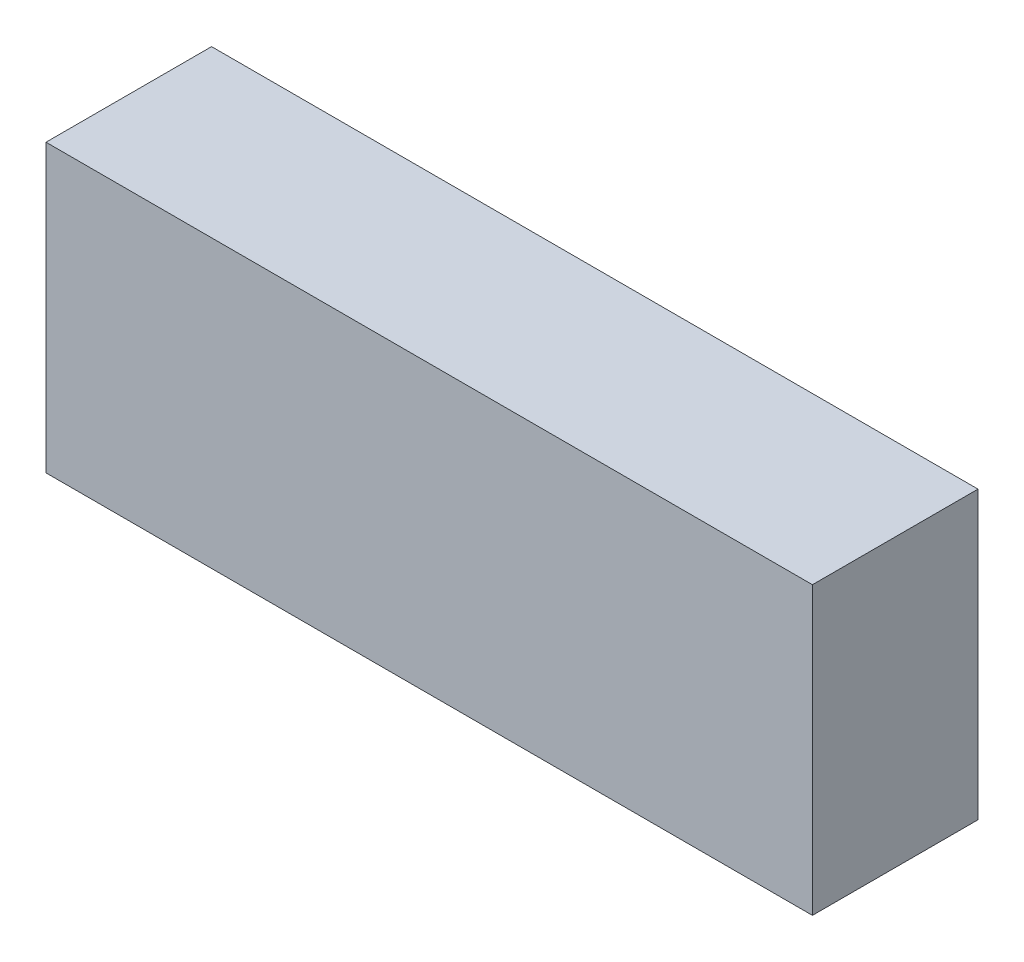
ISO-10303-21;
HEADER;
FILE_DESCRIPTION(('STEP AP214'),'2;1');
FILE_NAME('part.step','',(''),(''),'','','');
FILE_SCHEMA(('AUTOMOTIVE_DESIGN { 1 0 10303 214 1 1 1 1 }'));
ENDSEC;
DATA;
#1=APPLICATION_CONTEXT('core data for automotive mechanical design processes');
#2=APPLICATION_PROTOCOL_DEFINITION('international standard','automotive_design',2000,#1);
#3=PRODUCT_CONTEXT('',#1,'mechanical');
#4=PRODUCT('Part','Part','',(#3));
#5=PRODUCT_RELATED_PRODUCT_CATEGORY('part','',(#4));
#6=PRODUCT_DEFINITION_FORMATION('','',#4);
#7=PRODUCT_DEFINITION_CONTEXT('part definition',#1,'design');
#8=PRODUCT_DEFINITION('design','',#6,#7);
#9=PRODUCT_DEFINITION_SHAPE('','',#8);
#10=(LENGTH_UNIT() NAMED_UNIT(*) SI_UNIT(.MILLI.,.METRE.));
#11=(NAMED_UNIT(*) PLANE_ANGLE_UNIT() SI_UNIT($,.RADIAN.));
#12=(NAMED_UNIT(*) SI_UNIT($,.STERADIAN.) SOLID_ANGLE_UNIT());
#13=UNCERTAINTY_MEASURE_WITH_UNIT(LENGTH_MEASURE(1.E-05),#10,'distance_accuracy_value','');
#14=(GEOMETRIC_REPRESENTATION_CONTEXT(3) GLOBAL_UNCERTAINTY_ASSIGNED_CONTEXT((#13)) GLOBAL_UNIT_ASSIGNED_CONTEXT((#10,
#11,#12)) REPRESENTATION_CONTEXT('',''));
#15=CARTESIAN_POINT('',(0.,0.,0.));
#16=DIRECTION('',(0.,0.,1.));
#17=DIRECTION('',(1.,0.,0.));
#18=AXIS2_PLACEMENT_3D('',#15,#16,#17);
#19=CARTESIAN_POINT('',(-16.7754999999996,14.25,7.25));
#20=DIRECTION('',(1.,0.,0.));
#21=DIRECTION('',(0.,0.,-1.));
#22=AXIS2_PLACEMENT_3D('',#19,#20,#21);
#23=PLANE('',#22);
#24=DIRECTION('',(0.,-1.,0.));
#25=VECTOR('',#24,1.);
#26=CARTESIAN_POINT('',(-16.7754999999996,14.25,0.));
#27=LINE('',#26,#25);
#28=CARTESIAN_POINT('',(-16.7754999999996,14.25,0.));
#29=VERTEX_POINT('',#28);
#30=CARTESIAN_POINT('',(-16.7754999999996,1.71000000000001,0.));
#31=VERTEX_POINT('',#30);
#32=EDGE_CURVE('E128',#29,#31,#27,.T.);
#33=ORIENTED_EDGE('',*,*,#32,.T.);
#34=DIRECTION('',(0.,0.,-1.));
#35=VECTOR('',#34,1.);
#36=CARTESIAN_POINT('',(-16.7754999999996,1.71000000000001,7.25));
#37=LINE('',#36,#35);
#38=CARTESIAN_POINT('',(-16.7754999999996,1.71000000000001,7.25));
#39=VERTEX_POINT('',#38);
#40=EDGE_CURVE('E11',#39,#31,#37,.T.);
#41=ORIENTED_EDGE('',*,*,#40,.F.);
#42=DIRECTION('',(0.,-1.,0.));
#43=VECTOR('',#42,1.);
#44=CARTESIAN_POINT('',(-16.7754999999996,14.25,7.25));
#45=LINE('',#44,#43);
#46=CARTESIAN_POINT('',(-16.7754999999996,14.25,7.25));
#47=VERTEX_POINT('',#46);
#48=EDGE_CURVE('E148',#47,#39,#45,.T.);
#49=ORIENTED_EDGE('',*,*,#48,.F.);
#50=DIRECTION('',(0.,0.,-1.));
#51=VECTOR('',#50,1.);
#52=CARTESIAN_POINT('',(-16.7754999999996,14.25,7.25));
#53=LINE('',#52,#51);
#54=EDGE_CURVE('E153',#47,#29,#53,.T.);
#55=ORIENTED_EDGE('',*,*,#54,.T.);
#56=EDGE_LOOP('',(#33,#41,#49,#55));
#57=FACE_BOUND('',#56,.T.);
#58=ADVANCED_FACE('F32',(#57),#23,.F.);
#59=CARTESIAN_POINT('',(-16.7754999999996,1.71000000000001,7.25));
#60=DIRECTION('',(0.,1.,0.));
#61=DIRECTION('',(0.,0.,1.));
#62=AXIS2_PLACEMENT_3D('',#59,#60,#61);
#63=PLANE('',#62);
#64=DIRECTION('',(1.,0.,0.));
#65=VECTOR('',#64,1.);
#66=CARTESIAN_POINT('',(-16.7754999999996,1.71000000000001,0.));
#67=LINE('',#66,#65);
#68=CARTESIAN_POINT('',(16.7845000000004,1.71000000000001,0.));
#69=VERTEX_POINT('',#68);
#70=EDGE_CURVE('E132',#31,#69,#67,.T.);
#71=ORIENTED_EDGE('',*,*,#70,.T.);
#72=DIRECTION('',(0.,0.,-1.));
#73=VECTOR('',#72,1.);
#74=CARTESIAN_POINT('',(16.7845000000004,1.71000000000001,7.25));
#75=LINE('',#74,#73);
#76=CARTESIAN_POINT('',(16.7845000000004,1.71000000000001,7.25));
#77=VERTEX_POINT('',#76);
#78=EDGE_CURVE('E39',#77,#69,#75,.T.);
#79=ORIENTED_EDGE('',*,*,#78,.F.);
#80=DIRECTION('',(1.,0.,0.));
#81=VECTOR('',#80,1.);
#82=CARTESIAN_POINT('',(-16.7754999999996,1.71000000000001,7.25));
#83=LINE('',#82,#81);
#84=EDGE_CURVE('E83',#39,#77,#83,.T.);
#85=ORIENTED_EDGE('',*,*,#84,.F.);
#86=ORIENTED_EDGE('',*,*,#40,.T.);
#87=EDGE_LOOP('',(#71,#79,#85,#86));
#88=FACE_BOUND('',#87,.T.);
#89=ADVANCED_FACE('F182',(#88),#63,.F.);
#90=CARTESIAN_POINT('',(16.7845000000004,14.25,7.25));
#91=DIRECTION('',(-1.,0.,0.));
#92=DIRECTION('',(0.,0.,1.));
#93=AXIS2_PLACEMENT_3D('',#90,#91,#92);
#94=PLANE('',#93);
#95=DIRECTION('',(0.,1.,0.));
#96=VECTOR('',#95,1.);
#97=CARTESIAN_POINT('',(16.7845000000004,14.25,0.));
#98=LINE('',#97,#96);
#99=CARTESIAN_POINT('',(16.7845000000004,14.25,0.));
#100=VERTEX_POINT('',#99);
#101=EDGE_CURVE('E156',#69,#100,#98,.T.);
#102=ORIENTED_EDGE('',*,*,#101,.T.);
#103=DIRECTION('',(0.,0.,-1.));
#104=VECTOR('',#103,1.);
#105=CARTESIAN_POINT('',(16.7845000000004,14.25,7.25));
#106=LINE('',#105,#104);
#107=CARTESIAN_POINT('',(16.7845000000004,14.25,7.25));
#108=VERTEX_POINT('',#107);
#109=EDGE_CURVE('E160',#108,#100,#106,.T.);
#110=ORIENTED_EDGE('',*,*,#109,.F.);
#111=DIRECTION('',(0.,1.,0.));
#112=VECTOR('',#111,1.);
#113=CARTESIAN_POINT('',(16.7845000000004,14.25,7.25));
#114=LINE('',#113,#112);
#115=EDGE_CURVE('E151',#77,#108,#114,.T.);
#116=ORIENTED_EDGE('',*,*,#115,.F.);
#117=ORIENTED_EDGE('',*,*,#78,.T.);
#118=EDGE_LOOP('',(#102,#110,#116,#117));
#119=FACE_BOUND('',#118,.T.);
#120=ADVANCED_FACE('F165',(#119),#94,.F.);
#121=CARTESIAN_POINT('',(-16.7754999999996,14.25,7.25));
#122=DIRECTION('',(0.,-1.,0.));
#123=DIRECTION('',(0.,0.,-1.));
#124=AXIS2_PLACEMENT_3D('',#121,#122,#123);
#125=PLANE('',#124);
#126=DIRECTION('',(-1.,0.,0.));
#127=VECTOR('',#126,1.);
#128=CARTESIAN_POINT('',(-16.7754999999996,14.25,0.));
#129=LINE('',#128,#127);
#130=EDGE_CURVE('E76',#100,#29,#129,.T.);
#131=ORIENTED_EDGE('',*,*,#130,.T.);
#132=ORIENTED_EDGE('',*,*,#54,.F.);
#133=DIRECTION('',(-1.,0.,0.));
#134=VECTOR('',#133,1.);
#135=CARTESIAN_POINT('',(-16.7754999999996,14.25,7.25));
#136=LINE('',#135,#134);
#137=EDGE_CURVE('E55',#108,#47,#136,.T.);
#138=ORIENTED_EDGE('',*,*,#137,.F.);
#139=ORIENTED_EDGE('',*,*,#109,.T.);
#140=EDGE_LOOP('',(#131,#132,#138,#139));
#141=FACE_BOUND('',#140,.T.);
#142=ADVANCED_FACE('F173',(#141),#125,.F.);
#143=CARTESIAN_POINT('',(0.,0.,7.25));
#144=DIRECTION('',(0.,0.,1.));
#145=DIRECTION('',(1.,0.,0.));
#146=AXIS2_PLACEMENT_3D('',#143,#144,#145);
#147=PLANE('',#146);
#148=ORIENTED_EDGE('',*,*,#48,.T.);
#149=ORIENTED_EDGE('',*,*,#84,.T.);
#150=ORIENTED_EDGE('',*,*,#115,.T.);
#151=ORIENTED_EDGE('',*,*,#137,.T.);
#152=EDGE_LOOP('',(#148,#149,#150,#151));
#153=FACE_BOUND('',#152,.T.);
#154=ADVANCED_FACE('F175',(#153),#147,.T.);
#155=CARTESIAN_POINT('',(0.,0.,0.));
#156=DIRECTION('',(0.,0.,1.));
#157=DIRECTION('',(1.,0.,0.));
#158=AXIS2_PLACEMENT_3D('',#155,#156,#157);
#159=PLANE('',#158);
#160=DIRECTION('',(-1.,0.,0.));
#161=VECTOR('',#160,1.);
#162=CARTESIAN_POINT('',(-16.7754999999996,13.75,0.));
#163=LINE('',#162,#161);
#164=CARTESIAN_POINT('',(16.2845000000004,13.75,0.));
#165=VERTEX_POINT('',#164);
#166=CARTESIAN_POINT('',(-16.2754999999996,13.75,0.));
#167=VERTEX_POINT('',#166);
#168=EDGE_CURVE('E123',#165,#167,#163,.T.);
#169=ORIENTED_EDGE('',*,*,#168,.T.);
#170=DIRECTION('',(0.,-1.,0.));
#171=VECTOR('',#170,1.);
#172=CARTESIAN_POINT('',(-16.2754999999996,14.25,0.));
#173=LINE('',#172,#171);
#174=CARTESIAN_POINT('',(-16.2754999999996,2.21000000000001,0.));
#175=VERTEX_POINT('',#174);
#176=EDGE_CURVE('E142',#167,#175,#173,.T.);
#177=ORIENTED_EDGE('',*,*,#176,.T.);
#178=DIRECTION('',(1.,0.,0.));
#179=VECTOR('',#178,1.);
#180=CARTESIAN_POINT('',(-16.7754999999996,2.21000000000001,0.));
#181=LINE('',#180,#179);
#182=CARTESIAN_POINT('',(16.2845000000004,2.21000000000001,0.));
#183=VERTEX_POINT('',#182);
#184=EDGE_CURVE('E127',#175,#183,#181,.T.);
#185=ORIENTED_EDGE('',*,*,#184,.T.);
#186=DIRECTION('',(0.,1.,0.));
#187=VECTOR('',#186,1.);
#188=CARTESIAN_POINT('',(16.2845000000004,14.25,0.));
#189=LINE('',#188,#187);
#190=EDGE_CURVE('E46',#183,#165,#189,.T.);
#191=ORIENTED_EDGE('',*,*,#190,.T.);
#192=EDGE_LOOP('',(#169,#177,#185,#191));
#193=FACE_BOUND('',#192,.T.);
#194=ORIENTED_EDGE('',*,*,#32,.F.);
#195=ORIENTED_EDGE('',*,*,#130,.F.);
#196=ORIENTED_EDGE('',*,*,#101,.F.);
#197=ORIENTED_EDGE('',*,*,#70,.F.);
#198=EDGE_LOOP('',(#194,#195,#196,#197));
#199=FACE_BOUND('',#198,.T.);
#200=ADVANCED_FACE('F169',(#193,#199),#159,.F.);
#201=CARTESIAN_POINT('',(-16.2754999999996,14.25,7.25));
#202=DIRECTION('',(1.,0.,0.));
#203=DIRECTION('',(0.,0.,-1.));
#204=AXIS2_PLACEMENT_3D('',#201,#202,#203);
#205=PLANE('',#204);
#206=ORIENTED_EDGE('',*,*,#176,.F.);
#207=DIRECTION('',(0.,0.,-1.));
#208=VECTOR('',#207,1.);
#209=CARTESIAN_POINT('',(-16.2754999999996,13.75,7.25));
#210=LINE('',#209,#208);
#211=CARTESIAN_POINT('',(-16.2754999999996,13.75,7.05));
#212=VERTEX_POINT('',#211);
#213=EDGE_CURVE('E122',#212,#167,#210,.T.);
#214=ORIENTED_EDGE('',*,*,#213,.F.);
#215=DIRECTION('',(0.,-1.,0.));
#216=VECTOR('',#215,1.);
#217=CARTESIAN_POINT('',(-16.2754999999996,14.25,7.05));
#218=LINE('',#217,#216);
#219=CARTESIAN_POINT('',(-16.2754999999996,2.21000000000001,7.05));
#220=VERTEX_POINT('',#219);
#221=EDGE_CURVE('E110',#212,#220,#218,.T.);
#222=ORIENTED_EDGE('',*,*,#221,.T.);
#223=DIRECTION('',(0.,0.,-1.));
#224=VECTOR('',#223,1.);
#225=CARTESIAN_POINT('',(-16.2754999999996,2.21000000000001,7.25));
#226=LINE('',#225,#224);
#227=EDGE_CURVE('E120',#220,#175,#226,.T.);
#228=ORIENTED_EDGE('',*,*,#227,.T.);
#229=EDGE_LOOP('',(#206,#214,#222,#228));
#230=FACE_BOUND('',#229,.T.);
#231=ADVANCED_FACE('F119',(#230),#205,.T.);
#232=CARTESIAN_POINT('',(-16.7754999999996,2.21000000000001,7.25));
#233=DIRECTION('',(0.,1.,0.));
#234=DIRECTION('',(0.,0.,1.));
#235=AXIS2_PLACEMENT_3D('',#232,#233,#234);
#236=PLANE('',#235);
#237=ORIENTED_EDGE('',*,*,#184,.F.);
#238=ORIENTED_EDGE('',*,*,#227,.F.);
#239=DIRECTION('',(1.,0.,0.));
#240=VECTOR('',#239,1.);
#241=CARTESIAN_POINT('',(-16.7754999999996,2.21000000000001,7.05));
#242=LINE('',#241,#240);
#243=CARTESIAN_POINT('',(16.2845000000004,2.21000000000001,7.05));
#244=VERTEX_POINT('',#243);
#245=EDGE_CURVE('E106',#220,#244,#242,.T.);
#246=ORIENTED_EDGE('',*,*,#245,.T.);
#247=DIRECTION('',(0.,0.,-1.));
#248=VECTOR('',#247,1.);
#249=CARTESIAN_POINT('',(16.2845000000004,2.21000000000001,7.25));
#250=LINE('',#249,#248);
#251=EDGE_CURVE('E129',#244,#183,#250,.T.);
#252=ORIENTED_EDGE('',*,*,#251,.T.);
#253=EDGE_LOOP('',(#237,#238,#246,#252));
#254=FACE_BOUND('',#253,.T.);
#255=ADVANCED_FACE('F125',(#254),#236,.T.);
#256=CARTESIAN_POINT('',(16.2845000000004,14.25,7.25));
#257=DIRECTION('',(-1.,0.,0.));
#258=DIRECTION('',(0.,0.,1.));
#259=AXIS2_PLACEMENT_3D('',#256,#257,#258);
#260=PLANE('',#259);
#261=ORIENTED_EDGE('',*,*,#190,.F.);
#262=ORIENTED_EDGE('',*,*,#251,.F.);
#263=DIRECTION('',(0.,1.,0.));
#264=VECTOR('',#263,1.);
#265=CARTESIAN_POINT('',(16.2845000000004,14.25,7.05));
#266=LINE('',#265,#264);
#267=CARTESIAN_POINT('',(16.2845000000004,13.75,7.05));
#268=VERTEX_POINT('',#267);
#269=EDGE_CURVE('E111',#244,#268,#266,.T.);
#270=ORIENTED_EDGE('',*,*,#269,.T.);
#271=DIRECTION('',(0.,0.,-1.));
#272=VECTOR('',#271,1.);
#273=CARTESIAN_POINT('',(16.2845000000004,13.75,7.25));
#274=LINE('',#273,#272);
#275=EDGE_CURVE('E134',#268,#165,#274,.T.);
#276=ORIENTED_EDGE('',*,*,#275,.T.);
#277=EDGE_LOOP('',(#261,#262,#270,#276));
#278=FACE_BOUND('',#277,.T.);
#279=ADVANCED_FACE('F230',(#278),#260,.T.);
#280=CARTESIAN_POINT('',(-16.7754999999996,13.75,7.25));
#281=DIRECTION('',(0.,-1.,0.));
#282=DIRECTION('',(0.,0.,-1.));
#283=AXIS2_PLACEMENT_3D('',#280,#281,#282);
#284=PLANE('',#283);
#285=ORIENTED_EDGE('',*,*,#168,.F.);
#286=ORIENTED_EDGE('',*,*,#275,.F.);
#287=DIRECTION('',(-1.,0.,0.));
#288=VECTOR('',#287,1.);
#289=CARTESIAN_POINT('',(-16.7754999999996,13.75,7.05));
#290=LINE('',#289,#288);
#291=EDGE_CURVE('E137',#268,#212,#290,.T.);
#292=ORIENTED_EDGE('',*,*,#291,.T.);
#293=ORIENTED_EDGE('',*,*,#213,.T.);
#294=EDGE_LOOP('',(#285,#286,#292,#293));
#295=FACE_BOUND('',#294,.T.);
#296=ADVANCED_FACE('F239',(#295),#284,.T.);
#297=CARTESIAN_POINT('',(0.,0.,7.05));
#298=DIRECTION('',(0.,0.,1.));
#299=DIRECTION('',(1.,0.,0.));
#300=AXIS2_PLACEMENT_3D('',#297,#298,#299);
#301=PLANE('',#300);
#302=ORIENTED_EDGE('',*,*,#221,.F.);
#303=ORIENTED_EDGE('',*,*,#291,.F.);
#304=ORIENTED_EDGE('',*,*,#269,.F.);
#305=ORIENTED_EDGE('',*,*,#245,.F.);
#306=EDGE_LOOP('',(#302,#303,#304,#305));
#307=FACE_BOUND('',#306,.T.);
#308=ADVANCED_FACE('F108',(#307),#301,.F.);
#309=CLOSED_SHELL('',(#58,#89,#120,#142,#154,#200,#231,#255,#279,#296,#308));
#310=MANIFOLD_SOLID_BREP('B2',#309);
#311=ADVANCED_BREP_SHAPE_REPRESENTATION('',(#18,#310),#14);
#312=SHAPE_DEFINITION_REPRESENTATION(#9,#311);
ENDSEC;
END-ISO-10303-21;
